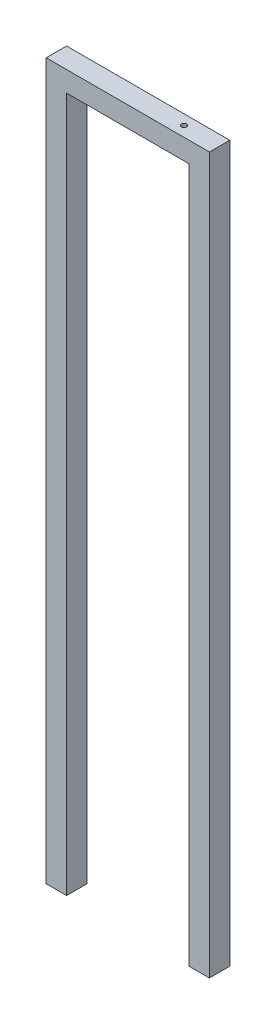
ISO-10303-21;
HEADER;
FILE_DESCRIPTION(('STEP AP214'),'2;1');
FILE_NAME('part.step','',(''),(''),'','','');
FILE_SCHEMA(('AUTOMOTIVE_DESIGN { 1 0 10303 214 1 1 1 1 }'));
ENDSEC;
DATA;
#1=APPLICATION_CONTEXT('core data for automotive mechanical design processes');
#2=APPLICATION_PROTOCOL_DEFINITION('international standard','automotive_design',2000,#1);
#3=PRODUCT_CONTEXT('',#1,'mechanical');
#4=PRODUCT('Part','Part','',(#3));
#5=PRODUCT_RELATED_PRODUCT_CATEGORY('part','',(#4));
#6=PRODUCT_DEFINITION_FORMATION('','',#4);
#7=PRODUCT_DEFINITION_CONTEXT('part definition',#1,'design');
#8=PRODUCT_DEFINITION('design','',#6,#7);
#9=PRODUCT_DEFINITION_SHAPE('','',#8);
#10=(LENGTH_UNIT() NAMED_UNIT(*) SI_UNIT(.MILLI.,.METRE.));
#11=(NAMED_UNIT(*) PLANE_ANGLE_UNIT() SI_UNIT($,.RADIAN.));
#12=(NAMED_UNIT(*) SI_UNIT($,.STERADIAN.) SOLID_ANGLE_UNIT());
#13=UNCERTAINTY_MEASURE_WITH_UNIT(LENGTH_MEASURE(1.E-05),#10,'distance_accuracy_value','');
#14=(GEOMETRIC_REPRESENTATION_CONTEXT(3) GLOBAL_UNCERTAINTY_ASSIGNED_CONTEXT((#13)) GLOBAL_UNIT_ASSIGNED_CONTEXT((#10,
#11,#12)) REPRESENTATION_CONTEXT('',''));
#15=CARTESIAN_POINT('',(0.,0.,0.));
#16=DIRECTION('',(0.,0.,1.));
#17=DIRECTION('',(1.,0.,0.));
#18=AXIS2_PLACEMENT_3D('',#15,#16,#17);
#19=CARTESIAN_POINT('',(-56.5467625899281,0.,20.));
#20=DIRECTION('',(-1.,0.,0.));
#21=DIRECTION('',(0.,0.,1.));
#22=AXIS2_PLACEMENT_3D('',#19,#20,#21);
#23=PLANE('',#22);
#24=DIRECTION('',(0.,1.,0.));
#25=VECTOR('',#24,1.);
#26=CARTESIAN_POINT('',(-56.5467625899281,0.,0.));
#27=LINE('',#26,#25);
#28=CARTESIAN_POINT('',(-56.5467625899281,-608.919928057554,0.));
#29=VERTEX_POINT('',#28);
#30=CARTESIAN_POINT('',(-56.5467625899281,72.410071942446,0.));
#31=VERTEX_POINT('',#30);
#32=EDGE_CURVE('E129',#29,#31,#27,.T.);
#33=ORIENTED_EDGE('',*,*,#32,.T.);
#34=DIRECTION('',(0.,0.,-1.));
#35=VECTOR('',#34,1.);
#36=CARTESIAN_POINT('',(-56.5467625899281,72.410071942446,20.));
#37=LINE('',#36,#35);
#38=CARTESIAN_POINT('',(-56.5467625899281,72.410071942446,20.));
#39=VERTEX_POINT('',#38);
#40=EDGE_CURVE('E11',#39,#31,#37,.T.);
#41=ORIENTED_EDGE('',*,*,#40,.F.);
#42=DIRECTION('',(0.,1.,0.));
#43=VECTOR('',#42,1.);
#44=CARTESIAN_POINT('',(-56.5467625899281,0.,20.));
#45=LINE('',#44,#43);
#46=CARTESIAN_POINT('',(-56.5467625899281,-608.919928057554,20.));
#47=VERTEX_POINT('',#46);
#48=EDGE_CURVE('E147',#47,#39,#45,.T.);
#49=ORIENTED_EDGE('',*,*,#48,.F.);
#50=DIRECTION('',(0.,0.,-1.));
#51=VECTOR('',#50,1.);
#52=CARTESIAN_POINT('',(-56.5467625899281,-608.919928057554,20.));
#53=LINE('',#52,#51);
#54=EDGE_CURVE('E125',#47,#29,#53,.T.);
#55=ORIENTED_EDGE('',*,*,#54,.T.);
#56=EDGE_LOOP('',(#33,#41,#49,#55));
#57=FACE_BOUND('',#56,.T.);
#58=ADVANCED_FACE('F35',(#57),#23,.F.);
#59=CARTESIAN_POINT('',(0.,72.410071942446,20.));
#60=DIRECTION('',(0.,1.,0.));
#61=DIRECTION('',(-1.,0.,0.));
#62=AXIS2_PLACEMENT_3D('',#59,#60,#61);
#63=PLANE('',#62);
#64=DIRECTION('',(1.,0.,0.));
#65=VECTOR('',#64,1.);
#66=CARTESIAN_POINT('',(0.,72.410071942446,0.));
#67=LINE('',#66,#65);
#68=CARTESIAN_POINT('',(63.4532374100719,72.4100719424461,0.));
#69=VERTEX_POINT('',#68);
#70=EDGE_CURVE('E132',#31,#69,#67,.T.);
#71=ORIENTED_EDGE('',*,*,#70,.T.);
#72=DIRECTION('',(0.,0.,-1.));
#73=VECTOR('',#72,1.);
#74=CARTESIAN_POINT('',(63.4532374100719,72.4100719424461,20.));
#75=LINE('',#74,#73);
#76=CARTESIAN_POINT('',(63.4532374100719,72.4100719424461,20.));
#77=VERTEX_POINT('',#76);
#78=EDGE_CURVE('E43',#77,#69,#75,.T.);
#79=ORIENTED_EDGE('',*,*,#78,.F.);
#80=DIRECTION('',(1.,0.,0.));
#81=VECTOR('',#80,1.);
#82=CARTESIAN_POINT('',(0.,72.410071942446,20.));
#83=LINE('',#82,#81);
#84=EDGE_CURVE('E90',#39,#77,#83,.T.);
#85=ORIENTED_EDGE('',*,*,#84,.F.);
#86=ORIENTED_EDGE('',*,*,#40,.T.);
#87=EDGE_LOOP('',(#71,#79,#85,#86));
#88=FACE_BOUND('',#87,.T.);
#89=ADVANCED_FACE('F203',(#88),#63,.F.);
#90=CARTESIAN_POINT('',(63.4532374100719,0.,20.));
#91=DIRECTION('',(1.,0.,0.));
#92=DIRECTION('',(0.,1.,0.));
#93=AXIS2_PLACEMENT_3D('',#90,#91,#92);
#94=PLANE('',#93);
#95=DIRECTION('',(0.,-1.,0.));
#96=VECTOR('',#95,1.);
#97=CARTESIAN_POINT('',(63.4532374100719,0.,0.));
#98=LINE('',#97,#96);
#99=CARTESIAN_POINT('',(63.453237410072,-608.919928057554,0.));
#100=VERTEX_POINT('',#99);
#101=EDGE_CURVE('E135',#69,#100,#98,.T.);
#102=ORIENTED_EDGE('',*,*,#101,.T.);
#103=DIRECTION('',(0.,0.,-1.));
#104=VECTOR('',#103,1.);
#105=CARTESIAN_POINT('',(63.453237410072,-608.919928057554,20.));
#106=LINE('',#105,#104);
#107=CARTESIAN_POINT('',(63.453237410072,-608.919928057554,20.));
#108=VERTEX_POINT('',#107);
#109=EDGE_CURVE('E153',#108,#100,#106,.T.);
#110=ORIENTED_EDGE('',*,*,#109,.F.);
#111=DIRECTION('',(0.,-1.,0.));
#112=VECTOR('',#111,1.);
#113=CARTESIAN_POINT('',(63.4532374100719,0.,20.));
#114=LINE('',#113,#112);
#115=EDGE_CURVE('E161',#77,#108,#114,.T.);
#116=ORIENTED_EDGE('',*,*,#115,.F.);
#117=ORIENTED_EDGE('',*,*,#78,.T.);
#118=EDGE_LOOP('',(#102,#110,#116,#117));
#119=FACE_BOUND('',#118,.T.);
#120=ADVANCED_FACE('F159',(#119),#94,.F.);
#121=CARTESIAN_POINT('',(0.,-608.919928057554,20.));
#122=DIRECTION('',(0.,1.,0.));
#123=DIRECTION('',(0.,0.,1.));
#124=AXIS2_PLACEMENT_3D('',#121,#122,#123);
#125=PLANE('',#124);
#126=DIRECTION('',(1.,0.,0.));
#127=VECTOR('',#126,1.);
#128=CARTESIAN_POINT('',(0.,-608.919928057554,0.));
#129=LINE('',#128,#127);
#130=CARTESIAN_POINT('',(83.453237410072,-608.919928057554,0.));
#131=VERTEX_POINT('',#130);
#132=EDGE_CURVE('E137',#100,#131,#129,.T.);
#133=ORIENTED_EDGE('',*,*,#132,.T.);
#134=DIRECTION('',(0.,0.,-1.));
#135=VECTOR('',#134,1.);
#136=CARTESIAN_POINT('',(83.453237410072,-608.919928057554,20.));
#137=LINE('',#136,#135);
#138=CARTESIAN_POINT('',(83.453237410072,-608.919928057554,20.));
#139=VERTEX_POINT('',#138);
#140=EDGE_CURVE('E151',#139,#131,#137,.T.);
#141=ORIENTED_EDGE('',*,*,#140,.F.);
#142=DIRECTION('',(1.,0.,0.));
#143=VECTOR('',#142,1.);
#144=CARTESIAN_POINT('',(0.,-608.919928057554,20.));
#145=LINE('',#144,#143);
#146=EDGE_CURVE('E171',#108,#139,#145,.T.);
#147=ORIENTED_EDGE('',*,*,#146,.F.);
#148=ORIENTED_EDGE('',*,*,#109,.T.);
#149=EDGE_LOOP('',(#133,#141,#147,#148));
#150=FACE_BOUND('',#149,.T.);
#151=ADVANCED_FACE('F169',(#150),#125,.F.);
#152=CARTESIAN_POINT('',(83.4532374100719,0.,20.));
#153=DIRECTION('',(1.,0.,0.));
#154=DIRECTION('',(0.,1.,0.));
#155=AXIS2_PLACEMENT_3D('',#152,#153,#154);
#156=PLANE('',#155);
#157=DIRECTION('',(0.,-1.,0.));
#158=VECTOR('',#157,1.);
#159=CARTESIAN_POINT('',(83.4532374100719,0.,0.));
#160=LINE('',#159,#158);
#161=CARTESIAN_POINT('',(83.4532374100719,92.4100719424461,0.));
#162=VERTEX_POINT('',#161);
#163=EDGE_CURVE('E140',#162,#131,#160,.T.);
#164=ORIENTED_EDGE('',*,*,#163,.F.);
#165=DIRECTION('',(0.,0.,-1.));
#166=VECTOR('',#165,1.);
#167=CARTESIAN_POINT('',(83.4532374100719,92.4100719424461,20.));
#168=LINE('',#167,#166);
#169=CARTESIAN_POINT('',(83.4532374100719,92.4100719424461,20.));
#170=VERTEX_POINT('',#169);
#171=EDGE_CURVE('E115',#170,#162,#168,.T.);
#172=ORIENTED_EDGE('',*,*,#171,.F.);
#173=DIRECTION('',(0.,-1.,0.));
#174=VECTOR('',#173,1.);
#175=CARTESIAN_POINT('',(83.4532374100719,0.,20.));
#176=LINE('',#175,#174);
#177=EDGE_CURVE('E121',#170,#139,#176,.T.);
#178=ORIENTED_EDGE('',*,*,#177,.T.);
#179=ORIENTED_EDGE('',*,*,#140,.T.);
#180=EDGE_LOOP('',(#164,#172,#178,#179));
#181=FACE_BOUND('',#180,.T.);
#182=ADVANCED_FACE('F192',(#181),#156,.T.);
#183=CARTESIAN_POINT('',(0.,92.4100719424461,20.));
#184=DIRECTION('',(0.,1.,0.));
#185=DIRECTION('',(-1.,0.,0.));
#186=AXIS2_PLACEMENT_3D('',#183,#184,#185);
#187=PLANE('',#186);
#188=CARTESIAN_POINT('',(48.4532374100719,92.4100719424461,10.));
#189=DIRECTION('',(0.,1.,0.));
#190=DIRECTION('',(-1.,0.,0.));
#191=AXIS2_PLACEMENT_3D('',#188,#189,#190);
#192=CIRCLE('',#191,2.49999999999999);
#193=CARTESIAN_POINT('',(45.9532374100719,92.4100719424461,10.));
#194=VERTEX_POINT('',#193);
#195=EDGE_CURVE('E177',#194,#194,#192,.T.);
#196=ORIENTED_EDGE('',*,*,#195,.F.);
#197=EDGE_LOOP('',(#196));
#198=FACE_BOUND('',#197,.T.);
#199=DIRECTION('',(1.,0.,0.));
#200=VECTOR('',#199,1.);
#201=CARTESIAN_POINT('',(0.,92.4100719424461,0.));
#202=LINE('',#201,#200);
#203=CARTESIAN_POINT('',(-76.5467625899281,92.4100719424461,0.));
#204=VERTEX_POINT('',#203);
#205=EDGE_CURVE('E110',#204,#162,#202,.T.);
#206=ORIENTED_EDGE('',*,*,#205,.F.);
#207=DIRECTION('',(0.,0.,-1.));
#208=VECTOR('',#207,1.);
#209=CARTESIAN_POINT('',(-76.5467625899281,92.4100719424461,20.));
#210=LINE('',#209,#208);
#211=CARTESIAN_POINT('',(-76.5467625899281,92.4100719424461,20.));
#212=VERTEX_POINT('',#211);
#213=EDGE_CURVE('E105',#212,#204,#210,.T.);
#214=ORIENTED_EDGE('',*,*,#213,.F.);
#215=DIRECTION('',(1.,0.,0.));
#216=VECTOR('',#215,1.);
#217=CARTESIAN_POINT('',(0.,92.4100719424461,20.));
#218=LINE('',#217,#216);
#219=EDGE_CURVE('E108',#212,#170,#218,.T.);
#220=ORIENTED_EDGE('',*,*,#219,.T.);
#221=ORIENTED_EDGE('',*,*,#171,.T.);
#222=EDGE_LOOP('',(#206,#214,#220,#221));
#223=FACE_BOUND('',#222,.T.);
#224=ADVANCED_FACE('F107',(#198,#223),#187,.T.);
#225=CARTESIAN_POINT('',(-76.5467625899281,0.,20.));
#226=DIRECTION('',(-1.,0.,0.));
#227=DIRECTION('',(0.,0.,1.));
#228=AXIS2_PLACEMENT_3D('',#225,#226,#227);
#229=PLANE('',#228);
#230=DIRECTION('',(0.,1.,0.));
#231=VECTOR('',#230,1.);
#232=CARTESIAN_POINT('',(-76.5467625899281,0.,0.));
#233=LINE('',#232,#231);
#234=CARTESIAN_POINT('',(-76.5467625899281,-608.919928057554,0.));
#235=VERTEX_POINT('',#234);
#236=EDGE_CURVE('E144',#235,#204,#233,.T.);
#237=ORIENTED_EDGE('',*,*,#236,.F.);
#238=DIRECTION('',(0.,0.,-1.));
#239=VECTOR('',#238,1.);
#240=CARTESIAN_POINT('',(-76.5467625899281,-608.919928057554,20.));
#241=LINE('',#240,#239);
#242=CARTESIAN_POINT('',(-76.5467625899281,-608.919928057554,20.));
#243=VERTEX_POINT('',#242);
#244=EDGE_CURVE('E79',#243,#235,#241,.T.);
#245=ORIENTED_EDGE('',*,*,#244,.F.);
#246=DIRECTION('',(0.,1.,0.));
#247=VECTOR('',#246,1.);
#248=CARTESIAN_POINT('',(-76.5467625899281,0.,20.));
#249=LINE('',#248,#247);
#250=EDGE_CURVE('E119',#243,#212,#249,.T.);
#251=ORIENTED_EDGE('',*,*,#250,.T.);
#252=ORIENTED_EDGE('',*,*,#213,.T.);
#253=EDGE_LOOP('',(#237,#245,#251,#252));
#254=FACE_BOUND('',#253,.T.);
#255=ADVANCED_FACE('F123',(#254),#229,.T.);
#256=CARTESIAN_POINT('',(0.,-608.919928057554,20.));
#257=DIRECTION('',(0.,1.,0.));
#258=DIRECTION('',(0.,0.,1.));
#259=AXIS2_PLACEMENT_3D('',#256,#257,#258);
#260=PLANE('',#259);
#261=DIRECTION('',(1.,0.,0.));
#262=VECTOR('',#261,1.);
#263=CARTESIAN_POINT('',(0.,-608.919928057554,0.));
#264=LINE('',#263,#262);
#265=EDGE_CURVE('E82',#235,#29,#264,.T.);
#266=ORIENTED_EDGE('',*,*,#265,.T.);
#267=ORIENTED_EDGE('',*,*,#54,.F.);
#268=DIRECTION('',(1.,0.,0.));
#269=VECTOR('',#268,1.);
#270=CARTESIAN_POINT('',(0.,-608.919928057554,20.));
#271=LINE('',#270,#269);
#272=EDGE_CURVE('E51',#243,#47,#271,.T.);
#273=ORIENTED_EDGE('',*,*,#272,.F.);
#274=ORIENTED_EDGE('',*,*,#244,.T.);
#275=EDGE_LOOP('',(#266,#267,#273,#274));
#276=FACE_BOUND('',#275,.T.);
#277=ADVANCED_FACE('F198',(#276),#260,.F.);
#278=CARTESIAN_POINT('',(0.,0.,20.));
#279=DIRECTION('',(0.,0.,1.));
#280=DIRECTION('',(1.,0.,0.));
#281=AXIS2_PLACEMENT_3D('',#278,#279,#280);
#282=PLANE('',#281);
#283=ORIENTED_EDGE('',*,*,#48,.T.);
#284=ORIENTED_EDGE('',*,*,#84,.T.);
#285=ORIENTED_EDGE('',*,*,#115,.T.);
#286=ORIENTED_EDGE('',*,*,#146,.T.);
#287=ORIENTED_EDGE('',*,*,#177,.F.);
#288=ORIENTED_EDGE('',*,*,#219,.F.);
#289=ORIENTED_EDGE('',*,*,#250,.F.);
#290=ORIENTED_EDGE('',*,*,#272,.T.);
#291=EDGE_LOOP('',(#283,#284,#285,#286,#287,#288,#289,#290));
#292=FACE_BOUND('',#291,.T.);
#293=ADVANCED_FACE('F118',(#292),#282,.T.);
#294=CARTESIAN_POINT('',(0.,0.,0.));
#295=DIRECTION('',(0.,0.,1.));
#296=DIRECTION('',(1.,0.,0.));
#297=AXIS2_PLACEMENT_3D('',#294,#295,#296);
#298=PLANE('',#297);
#299=ORIENTED_EDGE('',*,*,#32,.F.);
#300=ORIENTED_EDGE('',*,*,#265,.F.);
#301=ORIENTED_EDGE('',*,*,#236,.T.);
#302=ORIENTED_EDGE('',*,*,#205,.T.);
#303=ORIENTED_EDGE('',*,*,#163,.T.);
#304=ORIENTED_EDGE('',*,*,#132,.F.);
#305=ORIENTED_EDGE('',*,*,#101,.F.);
#306=ORIENTED_EDGE('',*,*,#70,.F.);
#307=EDGE_LOOP('',(#299,#300,#301,#302,#303,#304,#305,#306));
#308=FACE_BOUND('',#307,.T.);
#309=ADVANCED_FACE('F165',(#308),#298,.F.);
#310=CARTESIAN_POINT('',(48.4532374100719,82.4100719424461,10.));
#311=DIRECTION('',(0.,1.,0.));
#312=DIRECTION('',(-1.,0.,0.));
#313=AXIS2_PLACEMENT_3D('',#310,#311,#312);
#314=CYLINDRICAL_SURFACE('',#313,2.49999999999999);
#315=CARTESIAN_POINT('',(48.4532374100719,82.4100719424461,10.));
#316=DIRECTION('',(0.,1.,0.));
#317=DIRECTION('',(-1.,0.,0.));
#318=AXIS2_PLACEMENT_3D('',#315,#316,#317);
#319=CIRCLE('',#318,2.49999999999999);
#320=CARTESIAN_POINT('',(45.9532374100719,82.4100719424461,10.));
#321=VERTEX_POINT('',#320);
#322=EDGE_CURVE('E133',#321,#321,#319,.T.);
#323=ORIENTED_EDGE('',*,*,#322,.F.);
#324=EDGE_LOOP('',(#323));
#325=FACE_BOUND('',#324,.T.);
#326=ORIENTED_EDGE('',*,*,#195,.T.);
#327=EDGE_LOOP('',(#326));
#328=FACE_BOUND('',#327,.T.);
#329=ADVANCED_FACE('F185',(#325,#328),#314,.F.);
#330=CARTESIAN_POINT('',(48.4532374100719,82.4100719424461,10.));
#331=DIRECTION('',(0.,1.,0.));
#332=DIRECTION('',(-1.,0.,0.));
#333=AXIS2_PLACEMENT_3D('',#330,#331,#332);
#334=PLANE('',#333);
#335=ORIENTED_EDGE('',*,*,#322,.T.);
#336=EDGE_LOOP('',(#335));
#337=FACE_BOUND('',#336,.T.);
#338=ADVANCED_FACE('F183',(#337),#334,.T.);
#339=CLOSED_SHELL('',(#58,#89,#120,#151,#182,#224,#255,#277,#293,#309,#329,#338));
#340=MANIFOLD_SOLID_BREP('B2',#339);
#341=ADVANCED_BREP_SHAPE_REPRESENTATION('',(#18,#340),#14);
#342=SHAPE_DEFINITION_REPRESENTATION(#9,#341);
ENDSEC;
END-ISO-10303-21;
